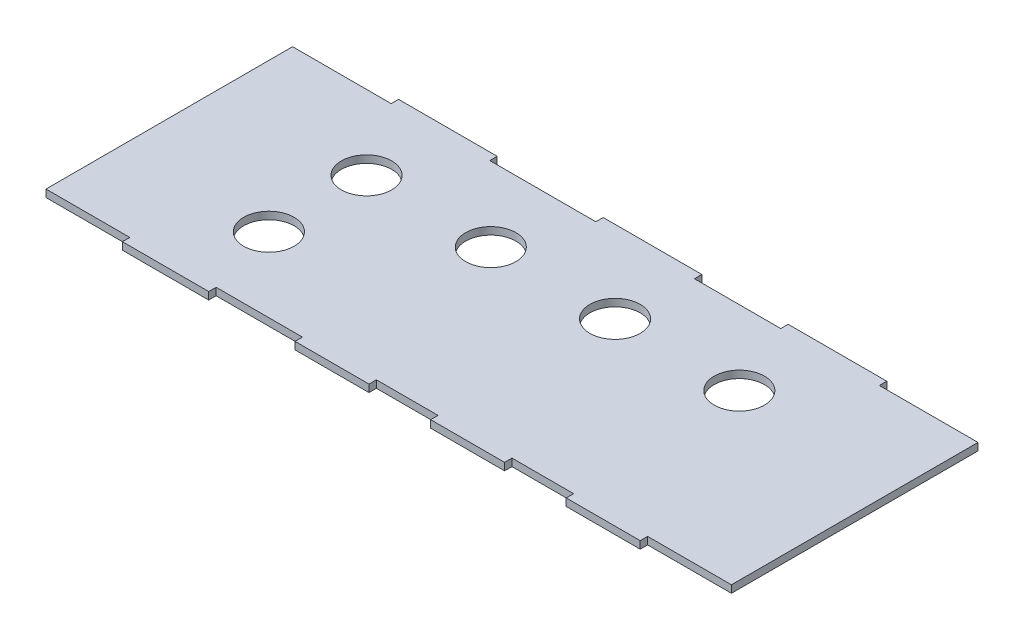
ISO-10303-21;
HEADER;
FILE_DESCRIPTION(('STEP AP214'),'2;1');
FILE_NAME('part.step','',(''),(''),'','','');
FILE_SCHEMA(('AUTOMOTIVE_DESIGN { 1 0 10303 214 1 1 1 1 }'));
ENDSEC;
DATA;
#1=APPLICATION_CONTEXT('core data for automotive mechanical design processes');
#2=APPLICATION_PROTOCOL_DEFINITION('international standard','automotive_design',2000,#1);
#3=PRODUCT_CONTEXT('',#1,'mechanical');
#4=PRODUCT('Part','Part','',(#3));
#5=PRODUCT_RELATED_PRODUCT_CATEGORY('part','',(#4));
#6=PRODUCT_DEFINITION_FORMATION('','',#4);
#7=PRODUCT_DEFINITION_CONTEXT('part definition',#1,'design');
#8=PRODUCT_DEFINITION('design','',#6,#7);
#9=PRODUCT_DEFINITION_SHAPE('','',#8);
#10=(LENGTH_UNIT() NAMED_UNIT(*) SI_UNIT(.MILLI.,.METRE.));
#11=(NAMED_UNIT(*) PLANE_ANGLE_UNIT() SI_UNIT($,.RADIAN.));
#12=(NAMED_UNIT(*) SI_UNIT($,.STERADIAN.) SOLID_ANGLE_UNIT());
#13=UNCERTAINTY_MEASURE_WITH_UNIT(LENGTH_MEASURE(1.E-05),#10,'distance_accuracy_value','');
#14=(GEOMETRIC_REPRESENTATION_CONTEXT(3) GLOBAL_UNCERTAINTY_ASSIGNED_CONTEXT((#13)) GLOBAL_UNIT_ASSIGNED_CONTEXT((#10,
#11,#12)) REPRESENTATION_CONTEXT('',''));
#15=CARTESIAN_POINT('',(0.,0.,0.));
#16=DIRECTION('',(0.,0.,1.));
#17=DIRECTION('',(1.,0.,0.));
#18=AXIS2_PLACEMENT_3D('',#15,#16,#17);
#19=CARTESIAN_POINT('',(-139.,3.,50.));
#20=DIRECTION('',(0.,0.,-1.));
#21=DIRECTION('',(-1.,0.,0.));
#22=AXIS2_PLACEMENT_3D('',#19,#20,#21);
#23=PLANE('',#22);
#24=DIRECTION('',(0.,-1.,0.));
#25=VECTOR('',#24,1.);
#26=CARTESIAN_POINT('',(75.0000000000471,3.,50.));
#27=LINE('',#26,#25);
#28=CARTESIAN_POINT('',(75.0000000000471,3.,50.));
#29=VERTEX_POINT('',#28);
#30=CARTESIAN_POINT('',(75.0000000000471,0.,50.));
#31=VERTEX_POINT('',#30);
#32=EDGE_CURVE('E55',#29,#31,#27,.T.);
#33=ORIENTED_EDGE('',*,*,#32,.F.);
#34=DIRECTION('',(1.,0.,0.));
#35=VECTOR('',#34,1.);
#36=CARTESIAN_POINT('',(-139.,3.,50.));
#37=LINE('',#36,#35);
#38=CARTESIAN_POINT('',(50.0000000000471,3.,50.));
#39=VERTEX_POINT('',#38);
#40=EDGE_CURVE('E615',#39,#29,#37,.T.);
#41=ORIENTED_EDGE('',*,*,#40,.F.);
#42=DIRECTION('',(0.,1.,0.));
#43=VECTOR('',#42,1.);
#44=CARTESIAN_POINT('',(50.0000000000471,3.,50.));
#45=LINE('',#44,#43);
#46=CARTESIAN_POINT('',(50.0000000000471,0.,50.));
#47=VERTEX_POINT('',#46);
#48=EDGE_CURVE('E268',#47,#39,#45,.T.);
#49=ORIENTED_EDGE('',*,*,#48,.F.);
#50=DIRECTION('',(1.,0.,0.));
#51=VECTOR('',#50,1.);
#52=CARTESIAN_POINT('',(-139.,0.,50.));
#53=LINE('',#52,#51);
#54=EDGE_CURVE('E626',#47,#31,#53,.T.);
#55=ORIENTED_EDGE('',*,*,#54,.T.);
#56=EDGE_LOOP('',(#33,#41,#49,#55));
#57=FACE_BOUND('',#56,.T.);
#58=ADVANCED_FACE('F32',(#57),#23,.F.);
#59=DIRECTION('',(0.,1.,0.));
#60=VECTOR('',#59,1.);
#61=CARTESIAN_POINT('',(105.000000000047,3.,50.));
#62=LINE('',#61,#60);
#63=CARTESIAN_POINT('',(105.000000000047,0.,50.));
#64=VERTEX_POINT('',#63);
#65=CARTESIAN_POINT('',(105.000000000047,3.,50.));
#66=VERTEX_POINT('',#65);
#67=EDGE_CURVE('E262',#64,#66,#62,.T.);
#68=ORIENTED_EDGE('',*,*,#67,.F.);
#69=CARTESIAN_POINT('',(139.,0.,50.));
#70=VERTEX_POINT('',#69);
#71=EDGE_CURVE('E481',#64,#70,#53,.T.);
#72=ORIENTED_EDGE('',*,*,#71,.T.);
#73=DIRECTION('',(0.,-1.,0.));
#74=VECTOR('',#73,1.);
#75=CARTESIAN_POINT('',(139.,3.,50.));
#76=LINE('',#75,#74);
#77=CARTESIAN_POINT('',(139.,3.,50.));
#78=VERTEX_POINT('',#77);
#79=EDGE_CURVE('E40',#78,#70,#76,.T.);
#80=ORIENTED_EDGE('',*,*,#79,.F.);
#81=EDGE_CURVE('E47',#66,#78,#37,.T.);
#82=ORIENTED_EDGE('',*,*,#81,.F.);
#83=EDGE_LOOP('',(#68,#72,#80,#82));
#84=FACE_BOUND('',#83,.T.);
#85=ADVANCED_FACE('F575',(#84),#23,.F.);
#86=DIRECTION('',(0.,-1.,0.));
#87=VECTOR('',#86,1.);
#88=CARTESIAN_POINT('',(20.0000000000471,3.,50.));
#89=LINE('',#88,#87);
#90=CARTESIAN_POINT('',(20.0000000000471,3.,50.));
#91=VERTEX_POINT('',#90);
#92=CARTESIAN_POINT('',(20.0000000000471,0.,50.));
#93=VERTEX_POINT('',#92);
#94=EDGE_CURVE('E265',#91,#93,#89,.T.);
#95=ORIENTED_EDGE('',*,*,#94,.F.);
#96=CARTESIAN_POINT('',(-4.99999999995288,3.,50.));
#97=VERTEX_POINT('',#96);
#98=EDGE_CURVE('E602',#97,#91,#37,.T.);
#99=ORIENTED_EDGE('',*,*,#98,.F.);
#100=DIRECTION('',(0.,1.,0.));
#101=VECTOR('',#100,1.);
#102=CARTESIAN_POINT('',(-4.99999999995288,3.,50.));
#103=LINE('',#102,#101);
#104=CARTESIAN_POINT('',(-4.9999999999529,0.,50.));
#105=VERTEX_POINT('',#104);
#106=EDGE_CURVE('E302',#105,#97,#103,.T.);
#107=ORIENTED_EDGE('',*,*,#106,.F.);
#108=EDGE_CURVE('E614',#105,#93,#53,.T.);
#109=ORIENTED_EDGE('',*,*,#108,.T.);
#110=EDGE_LOOP('',(#95,#99,#107,#109));
#111=FACE_BOUND('',#110,.T.);
#112=ADVANCED_FACE('F579',(#111),#23,.F.);
#113=DIRECTION('',(0.,-1.,0.));
#114=VECTOR('',#113,1.);
#115=CARTESIAN_POINT('',(-34.9999999999529,3.,50.));
#116=LINE('',#115,#114);
#117=CARTESIAN_POINT('',(-34.9999999999529,3.,50.));
#118=VERTEX_POINT('',#117);
#119=CARTESIAN_POINT('',(-34.9999999999529,0.,50.));
#120=VERTEX_POINT('',#119);
#121=EDGE_CURVE('E297',#118,#120,#116,.T.);
#122=ORIENTED_EDGE('',*,*,#121,.F.);
#123=CARTESIAN_POINT('',(-69.9999999999529,3.,50.));
#124=VERTEX_POINT('',#123);
#125=EDGE_CURVE('E471',#124,#118,#37,.T.);
#126=ORIENTED_EDGE('',*,*,#125,.F.);
#127=DIRECTION('',(0.,1.,0.));
#128=VECTOR('',#127,1.);
#129=CARTESIAN_POINT('',(-69.9999999999529,0.,50.));
#130=LINE('',#129,#128);
#131=CARTESIAN_POINT('',(-69.9999999999529,0.,50.));
#132=VERTEX_POINT('',#131);
#133=EDGE_CURVE('E329',#132,#124,#130,.T.);
#134=ORIENTED_EDGE('',*,*,#133,.F.);
#135=EDGE_CURVE('E485',#132,#120,#53,.T.);
#136=ORIENTED_EDGE('',*,*,#135,.T.);
#137=EDGE_LOOP('',(#122,#126,#134,#136));
#138=FACE_BOUND('',#137,.T.);
#139=ADVANCED_FACE('F582',(#138),#23,.F.);
#140=DIRECTION('',(0.,-1.,0.));
#141=VECTOR('',#140,1.);
#142=CARTESIAN_POINT('',(-104.999999999953,0.,50.));
#143=LINE('',#142,#141);
#144=CARTESIAN_POINT('',(-104.999999999953,3.,50.));
#145=VERTEX_POINT('',#144);
#146=CARTESIAN_POINT('',(-104.999999999953,0.,50.));
#147=VERTEX_POINT('',#146);
#148=EDGE_CURVE('E324',#145,#147,#143,.T.);
#149=ORIENTED_EDGE('',*,*,#148,.F.);
#150=CARTESIAN_POINT('',(-139.,3.,50.));
#151=VERTEX_POINT('',#150);
#152=EDGE_CURVE('E467',#151,#145,#37,.T.);
#153=ORIENTED_EDGE('',*,*,#152,.F.);
#154=DIRECTION('',(0.,-1.,0.));
#155=VECTOR('',#154,1.);
#156=CARTESIAN_POINT('',(-139.,3.,50.));
#157=LINE('',#156,#155);
#158=CARTESIAN_POINT('',(-139.,0.,50.));
#159=VERTEX_POINT('',#158);
#160=EDGE_CURVE('E11',#151,#159,#157,.T.);
#161=ORIENTED_EDGE('',*,*,#160,.T.);
#162=EDGE_CURVE('E482',#159,#147,#53,.T.);
#163=ORIENTED_EDGE('',*,*,#162,.T.);
#164=EDGE_LOOP('',(#149,#153,#161,#163));
#165=FACE_BOUND('',#164,.T.);
#166=ADVANCED_FACE('F538',(#165),#23,.F.);
#167=CARTESIAN_POINT('',(-139.,3.,-50.));
#168=DIRECTION('',(0.,0.,1.));
#169=DIRECTION('',(1.,0.,0.));
#170=AXIS2_PLACEMENT_3D('',#167,#168,#169);
#171=PLANE('',#170);
#172=DIRECTION('',(0.,-1.,0.));
#173=VECTOR('',#172,1.);
#174=CARTESIAN_POINT('',(-58.9999999999999,0.,-50.));
#175=LINE('',#174,#173);
#176=CARTESIAN_POINT('',(-58.9999999999999,3.,-50.));
#177=VERTEX_POINT('',#176);
#178=CARTESIAN_POINT('',(-58.9999999999999,0.,-50.));
#179=VERTEX_POINT('',#178);
#180=EDGE_CURVE('E355',#177,#179,#175,.T.);
#181=ORIENTED_EDGE('',*,*,#180,.F.);
#182=DIRECTION('',(-1.,0.,0.));
#183=VECTOR('',#182,1.);
#184=CARTESIAN_POINT('',(-139.,3.,-50.));
#185=LINE('',#184,#183);
#186=CARTESIAN_POINT('',(-16.,3.,-50.));
#187=VERTEX_POINT('',#186);
#188=EDGE_CURVE('E542',#187,#177,#185,.T.);
#189=ORIENTED_EDGE('',*,*,#188,.F.);
#190=DIRECTION('',(0.,1.,0.));
#191=VECTOR('',#190,1.);
#192=CARTESIAN_POINT('',(-16.,0.,-50.));
#193=LINE('',#192,#191);
#194=CARTESIAN_POINT('',(-16.,0.,-50.));
#195=VERTEX_POINT('',#194);
#196=EDGE_CURVE('E413',#195,#187,#193,.T.);
#197=ORIENTED_EDGE('',*,*,#196,.F.);
#198=DIRECTION('',(-1.,0.,0.));
#199=VECTOR('',#198,1.);
#200=CARTESIAN_POINT('',(-139.,0.,-50.));
#201=LINE('',#200,#199);
#202=EDGE_CURVE('E525',#195,#179,#201,.T.);
#203=ORIENTED_EDGE('',*,*,#202,.T.);
#204=EDGE_LOOP('',(#181,#189,#197,#203));
#205=FACE_BOUND('',#204,.T.);
#206=ADVANCED_FACE('F558',(#205),#171,.F.);
#207=DIRECTION('',(0.,1.,0.));
#208=VECTOR('',#207,1.);
#209=CARTESIAN_POINT('',(-99.,0.,-50.));
#210=LINE('',#209,#208);
#211=CARTESIAN_POINT('',(-99.,0.,-50.));
#212=VERTEX_POINT('',#211);
#213=CARTESIAN_POINT('',(-99.,3.,-50.));
#214=VERTEX_POINT('',#213);
#215=EDGE_CURVE('E386',#212,#214,#210,.T.);
#216=ORIENTED_EDGE('',*,*,#215,.F.);
#217=CARTESIAN_POINT('',(-139.,0.,-50.));
#218=VERTEX_POINT('',#217);
#219=EDGE_CURVE('E487',#212,#218,#201,.T.);
#220=ORIENTED_EDGE('',*,*,#219,.T.);
#221=DIRECTION('',(0.,-1.,0.));
#222=VECTOR('',#221,1.);
#223=CARTESIAN_POINT('',(-139.,3.,-50.));
#224=LINE('',#223,#222);
#225=CARTESIAN_POINT('',(-139.,3.,-50.));
#226=VERTEX_POINT('',#225);
#227=EDGE_CURVE('E477',#226,#218,#224,.T.);
#228=ORIENTED_EDGE('',*,*,#227,.F.);
#229=EDGE_CURVE('E473',#214,#226,#185,.T.);
#230=ORIENTED_EDGE('',*,*,#229,.F.);
#231=EDGE_LOOP('',(#216,#220,#228,#230));
#232=FACE_BOUND('',#231,.T.);
#233=ADVANCED_FACE('F531',(#232),#171,.F.);
#234=DIRECTION('',(0.,-1.,0.));
#235=VECTOR('',#234,1.);
#236=CARTESIAN_POINT('',(24.,0.,-50.));
#237=LINE('',#236,#235);
#238=CARTESIAN_POINT('',(24.,3.,-50.));
#239=VERTEX_POINT('',#238);
#240=CARTESIAN_POINT('',(24.,0.,-50.));
#241=VERTEX_POINT('',#240);
#242=EDGE_CURVE('E408',#239,#241,#237,.T.);
#243=ORIENTED_EDGE('',*,*,#242,.F.);
#244=CARTESIAN_POINT('',(59.,3.,-50.));
#245=VERTEX_POINT('',#244);
#246=EDGE_CURVE('E478',#245,#239,#185,.T.);
#247=ORIENTED_EDGE('',*,*,#246,.F.);
#248=DIRECTION('',(0.,1.,0.));
#249=VECTOR('',#248,1.);
#250=CARTESIAN_POINT('',(59.,0.,-50.));
#251=LINE('',#250,#249);
#252=CARTESIAN_POINT('',(59.,0.,-50.));
#253=VERTEX_POINT('',#252);
#254=EDGE_CURVE('E440',#253,#245,#251,.T.);
#255=ORIENTED_EDGE('',*,*,#254,.F.);
#256=EDGE_CURVE('E489',#253,#241,#201,.T.);
#257=ORIENTED_EDGE('',*,*,#256,.T.);
#258=EDGE_LOOP('',(#243,#247,#255,#257));
#259=FACE_BOUND('',#258,.T.);
#260=ADVANCED_FACE('F523',(#259),#171,.F.);
#261=DIRECTION('',(0.,-1.,0.));
#262=VECTOR('',#261,1.);
#263=CARTESIAN_POINT('',(99.,0.,-50.));
#264=LINE('',#263,#262);
#265=CARTESIAN_POINT('',(99.,3.,-50.));
#266=VERTEX_POINT('',#265);
#267=CARTESIAN_POINT('',(99.,0.,-50.));
#268=VERTEX_POINT('',#267);
#269=EDGE_CURVE('E435',#266,#268,#264,.T.);
#270=ORIENTED_EDGE('',*,*,#269,.F.);
#271=CARTESIAN_POINT('',(139.,3.,-50.));
#272=VERTEX_POINT('',#271);
#273=EDGE_CURVE('E474',#272,#266,#185,.T.);
#274=ORIENTED_EDGE('',*,*,#273,.F.);
#275=DIRECTION('',(0.,-1.,0.));
#276=VECTOR('',#275,1.);
#277=CARTESIAN_POINT('',(139.,3.,-50.));
#278=LINE('',#277,#276);
#279=CARTESIAN_POINT('',(139.,0.,-50.));
#280=VERTEX_POINT('',#279);
#281=EDGE_CURVE('E492',#272,#280,#278,.T.);
#282=ORIENTED_EDGE('',*,*,#281,.T.);
#283=EDGE_CURVE('E466',#280,#268,#201,.T.);
#284=ORIENTED_EDGE('',*,*,#283,.T.);
#285=EDGE_LOOP('',(#270,#274,#282,#284));
#286=FACE_BOUND('',#285,.T.);
#287=ADVANCED_FACE('F503',(#286),#171,.F.);
#288=CARTESIAN_POINT('',(-139.,3.,-50.));
#289=DIRECTION('',(1.,0.,0.));
#290=DIRECTION('',(0.,0.,-1.));
#291=AXIS2_PLACEMENT_3D('',#288,#289,#290);
#292=PLANE('',#291);
#293=DIRECTION('',(0.,0.,1.));
#294=VECTOR('',#293,1.);
#295=CARTESIAN_POINT('',(-139.,0.,-50.));
#296=LINE('',#295,#294);
#297=EDGE_CURVE('E462',#218,#159,#296,.T.);
#298=ORIENTED_EDGE('',*,*,#297,.T.);
#299=ORIENTED_EDGE('',*,*,#160,.F.);
#300=DIRECTION('',(0.,0.,1.));
#301=VECTOR('',#300,1.);
#302=CARTESIAN_POINT('',(-139.,3.,-50.));
#303=LINE('',#302,#301);
#304=EDGE_CURVE('E463',#226,#151,#303,.T.);
#305=ORIENTED_EDGE('',*,*,#304,.F.);
#306=ORIENTED_EDGE('',*,*,#227,.T.);
#307=EDGE_LOOP('',(#298,#299,#305,#306));
#308=FACE_BOUND('',#307,.T.);
#309=ADVANCED_FACE('F34',(#308),#292,.F.);
#310=CARTESIAN_POINT('',(139.,3.,-50.));
#311=DIRECTION('',(-1.,0.,0.));
#312=DIRECTION('',(0.,0.,1.));
#313=AXIS2_PLACEMENT_3D('',#310,#311,#312);
#314=PLANE('',#313);
#315=DIRECTION('',(0.,0.,-1.));
#316=VECTOR('',#315,1.);
#317=CARTESIAN_POINT('',(139.,0.,-50.));
#318=LINE('',#317,#316);
#319=EDGE_CURVE('E484',#70,#280,#318,.T.);
#320=ORIENTED_EDGE('',*,*,#319,.T.);
#321=ORIENTED_EDGE('',*,*,#281,.F.);
#322=DIRECTION('',(0.,0.,-1.));
#323=VECTOR('',#322,1.);
#324=CARTESIAN_POINT('',(139.,3.,-50.));
#325=LINE('',#324,#323);
#326=EDGE_CURVE('E470',#78,#272,#325,.T.);
#327=ORIENTED_EDGE('',*,*,#326,.F.);
#328=ORIENTED_EDGE('',*,*,#79,.T.);
#329=EDGE_LOOP('',(#320,#321,#327,#328));
#330=FACE_BOUND('',#329,.T.);
#331=ADVANCED_FACE('F498',(#330),#314,.F.);
#332=CARTESIAN_POINT('',(0.,3.,0.));
#333=DIRECTION('',(0.,1.,0.));
#334=DIRECTION('',(0.,0.,1.));
#335=AXIS2_PLACEMENT_3D('',#332,#333,#334);
#336=PLANE('',#335);
#337=CARTESIAN_POINT('',(72.4,3.,-19.7999999999985));
#338=DIRECTION('',(0.,1.,0.));
#339=DIRECTION('',(0.,0.,1.));
#340=AXIS2_PLACEMENT_3D('',#337,#338,#339);
#341=CIRCLE('',#340,10.2);
#342=CARTESIAN_POINT('',(72.4,3.,-9.59999999999846));
#343=VERTEX_POINT('',#342);
#344=EDGE_CURVE('E356',#343,#343,#341,.T.);
#345=ORIENTED_EDGE('',*,*,#344,.F.);
#346=EDGE_LOOP('',(#345));
#347=FACE_BOUND('',#346,.T.);
#348=CARTESIAN_POINT('',(-78.8,3.,-19.7999999999985));
#349=DIRECTION('',(0.,1.,0.));
#350=DIRECTION('',(0.,0.,1.));
#351=AXIS2_PLACEMENT_3D('',#348,#349,#350);
#352=CIRCLE('',#351,10.2);
#353=CARTESIAN_POINT('',(-78.8,3.,-9.59999999999846));
#354=VERTEX_POINT('',#353);
#355=EDGE_CURVE('E351',#354,#354,#352,.T.);
#356=ORIENTED_EDGE('',*,*,#355,.F.);
#357=EDGE_LOOP('',(#356));
#358=FACE_BOUND('',#357,.T.);
#359=CARTESIAN_POINT('',(-28.4,3.,-19.7999999999985));
#360=DIRECTION('',(0.,1.,0.));
#361=DIRECTION('',(0.,0.,1.));
#362=AXIS2_PLACEMENT_3D('',#359,#360,#361);
#363=CIRCLE('',#362,10.2);
#364=CARTESIAN_POINT('',(-28.4,3.,-9.59999999999846));
#365=VERTEX_POINT('',#364);
#366=EDGE_CURVE('E364',#365,#365,#363,.T.);
#367=ORIENTED_EDGE('',*,*,#366,.F.);
#368=EDGE_LOOP('',(#367));
#369=FACE_BOUND('',#368,.T.);
#370=CARTESIAN_POINT('',(22.,3.,-19.7999999999985));
#371=DIRECTION('',(0.,1.,0.));
#372=DIRECTION('',(0.,0.,1.));
#373=AXIS2_PLACEMENT_3D('',#370,#371,#372);
#374=CIRCLE('',#373,10.2);
#375=CARTESIAN_POINT('',(22.,3.,-9.59999999999846));
#376=VERTEX_POINT('',#375);
#377=EDGE_CURVE('E363',#376,#376,#374,.T.);
#378=ORIENTED_EDGE('',*,*,#377,.F.);
#379=EDGE_LOOP('',(#378));
#380=FACE_BOUND('',#379,.T.);
#381=CARTESIAN_POINT('',(-78.8,3.,19.8));
#382=DIRECTION('',(0.,1.,0.));
#383=DIRECTION('',(0.,0.,1.));
#384=AXIS2_PLACEMENT_3D('',#381,#382,#383);
#385=CIRCLE('',#384,10.2);
#386=CARTESIAN_POINT('',(-78.8,3.,30.));
#387=VERTEX_POINT('',#386);
#388=EDGE_CURVE('E374',#387,#387,#385,.T.);
#389=ORIENTED_EDGE('',*,*,#388,.F.);
#390=EDGE_LOOP('',(#389));
#391=FACE_BOUND('',#390,.T.);
#392=ORIENTED_EDGE('',*,*,#304,.T.);
#393=ORIENTED_EDGE('',*,*,#152,.T.);
#394=DIRECTION('',(0.,0.,-1.));
#395=VECTOR('',#394,1.);
#396=CARTESIAN_POINT('',(-104.999999999953,3.,53.));
#397=LINE('',#396,#395);
#398=CARTESIAN_POINT('',(-104.999999999953,3.,53.));
#399=VERTEX_POINT('',#398);
#400=EDGE_CURVE('E335',#399,#145,#397,.T.);
#401=ORIENTED_EDGE('',*,*,#400,.F.);
#402=DIRECTION('',(-1.,0.,0.));
#403=VECTOR('',#402,1.);
#404=CARTESIAN_POINT('',(-104.999999999953,3.,53.));
#405=LINE('',#404,#403);
#406=CARTESIAN_POINT('',(-69.9999999999529,3.,53.));
#407=VERTEX_POINT('',#406);
#408=EDGE_CURVE('E333',#407,#399,#405,.T.);
#409=ORIENTED_EDGE('',*,*,#408,.F.);
#410=DIRECTION('',(0.,0.,-1.));
#411=VECTOR('',#410,1.);
#412=CARTESIAN_POINT('',(-69.9999999999529,3.,53.));
#413=LINE('',#412,#411);
#414=EDGE_CURVE('E342',#407,#124,#413,.T.);
#415=ORIENTED_EDGE('',*,*,#414,.T.);
#416=ORIENTED_EDGE('',*,*,#125,.T.);
#417=DIRECTION('',(0.,0.,-1.));
#418=VECTOR('',#417,1.);
#419=CARTESIAN_POINT('',(-34.9999999999529,3.,53.));
#420=LINE('',#419,#418);
#421=CARTESIAN_POINT('',(-34.9999999999529,3.,53.));
#422=VERTEX_POINT('',#421);
#423=EDGE_CURVE('E308',#422,#118,#420,.T.);
#424=ORIENTED_EDGE('',*,*,#423,.F.);
#425=DIRECTION('',(-1.,0.,0.));
#426=VECTOR('',#425,1.);
#427=CARTESIAN_POINT('',(-34.9999999999529,3.,53.));
#428=LINE('',#427,#426);
#429=CARTESIAN_POINT('',(-4.99999999995288,3.,53.));
#430=VERTEX_POINT('',#429);
#431=EDGE_CURVE('E306',#430,#422,#428,.T.);
#432=ORIENTED_EDGE('',*,*,#431,.F.);
#433=DIRECTION('',(0.,0.,-1.));
#434=VECTOR('',#433,1.);
#435=CARTESIAN_POINT('',(-4.99999999995288,3.,53.));
#436=LINE('',#435,#434);
#437=EDGE_CURVE('E315',#430,#97,#436,.T.);
#438=ORIENTED_EDGE('',*,*,#437,.T.);
#439=ORIENTED_EDGE('',*,*,#98,.T.);
#440=DIRECTION('',(0.,0.,-1.));
#441=VECTOR('',#440,1.);
#442=CARTESIAN_POINT('',(20.0000000000471,3.,53.));
#443=LINE('',#442,#441);
#444=CARTESIAN_POINT('',(20.0000000000471,3.,53.));
#445=VERTEX_POINT('',#444);
#446=EDGE_CURVE('E282',#445,#91,#443,.T.);
#447=ORIENTED_EDGE('',*,*,#446,.F.);
#448=DIRECTION('',(-1.,0.,0.));
#449=VECTOR('',#448,1.);
#450=CARTESIAN_POINT('',(20.0000000000471,3.,53.));
#451=LINE('',#450,#449);
#452=CARTESIAN_POINT('',(50.0000000000471,3.,53.));
#453=VERTEX_POINT('',#452);
#454=EDGE_CURVE('E281',#453,#445,#451,.T.);
#455=ORIENTED_EDGE('',*,*,#454,.F.);
#456=DIRECTION('',(0.,0.,-1.));
#457=VECTOR('',#456,1.);
#458=CARTESIAN_POINT('',(50.0000000000471,3.,53.));
#459=LINE('',#458,#457);
#460=EDGE_CURVE('E288',#453,#39,#459,.T.);
#461=ORIENTED_EDGE('',*,*,#460,.T.);
#462=ORIENTED_EDGE('',*,*,#40,.T.);
#463=DIRECTION('',(0.,0.,-1.));
#464=VECTOR('',#463,1.);
#465=CARTESIAN_POINT('',(75.0000000000471,3.,53.));
#466=LINE('',#465,#464);
#467=CARTESIAN_POINT('',(75.0000000000471,3.,53.));
#468=VERTEX_POINT('',#467);
#469=EDGE_CURVE('E619',#468,#29,#466,.T.);
#470=ORIENTED_EDGE('',*,*,#469,.F.);
#471=DIRECTION('',(-1.,0.,0.));
#472=VECTOR('',#471,1.);
#473=CARTESIAN_POINT('',(75.0000000000471,3.,53.));
#474=LINE('',#473,#472);
#475=CARTESIAN_POINT('',(105.000000000047,3.,53.));
#476=VERTEX_POINT('',#475);
#477=EDGE_CURVE('E258',#476,#468,#474,.T.);
#478=ORIENTED_EDGE('',*,*,#477,.F.);
#479=DIRECTION('',(0.,0.,-1.));
#480=VECTOR('',#479,1.);
#481=CARTESIAN_POINT('',(105.000000000047,3.,53.));
#482=LINE('',#481,#480);
#483=EDGE_CURVE('E270',#476,#66,#482,.T.);
#484=ORIENTED_EDGE('',*,*,#483,.T.);
#485=ORIENTED_EDGE('',*,*,#81,.T.);
#486=ORIENTED_EDGE('',*,*,#326,.T.);
#487=ORIENTED_EDGE('',*,*,#273,.T.);
#488=DIRECTION('',(0.,0.,1.));
#489=VECTOR('',#488,1.);
#490=CARTESIAN_POINT('',(99.,3.,-53.));
#491=LINE('',#490,#489);
#492=CARTESIAN_POINT('',(99.,3.,-53.));
#493=VERTEX_POINT('',#492);
#494=EDGE_CURVE('E446',#493,#266,#491,.T.);
#495=ORIENTED_EDGE('',*,*,#494,.F.);
#496=DIRECTION('',(1.,0.,0.));
#497=VECTOR('',#496,1.);
#498=CARTESIAN_POINT('',(99.,3.,-53.));
#499=LINE('',#498,#497);
#500=CARTESIAN_POINT('',(59.,3.,-53.));
#501=VERTEX_POINT('',#500);
#502=EDGE_CURVE('E444',#501,#493,#499,.T.);
#503=ORIENTED_EDGE('',*,*,#502,.F.);
#504=DIRECTION('',(0.,0.,1.));
#505=VECTOR('',#504,1.);
#506=CARTESIAN_POINT('',(59.,3.,-53.));
#507=LINE('',#506,#505);
#508=EDGE_CURVE('E453',#501,#245,#507,.T.);
#509=ORIENTED_EDGE('',*,*,#508,.T.);
#510=ORIENTED_EDGE('',*,*,#246,.T.);
#511=DIRECTION('',(0.,0.,1.));
#512=VECTOR('',#511,1.);
#513=CARTESIAN_POINT('',(24.,3.,-53.));
#514=LINE('',#513,#512);
#515=CARTESIAN_POINT('',(24.,3.,-53.));
#516=VERTEX_POINT('',#515);
#517=EDGE_CURVE('E419',#516,#239,#514,.T.);
#518=ORIENTED_EDGE('',*,*,#517,.F.);
#519=DIRECTION('',(1.,0.,0.));
#520=VECTOR('',#519,1.);
#521=CARTESIAN_POINT('',(24.,3.,-53.));
#522=LINE('',#521,#520);
#523=CARTESIAN_POINT('',(-16.,3.,-53.));
#524=VERTEX_POINT('',#523);
#525=EDGE_CURVE('E417',#524,#516,#522,.T.);
#526=ORIENTED_EDGE('',*,*,#525,.F.);
#527=DIRECTION('',(0.,0.,1.));
#528=VECTOR('',#527,1.);
#529=CARTESIAN_POINT('',(-16.,3.,-53.));
#530=LINE('',#529,#528);
#531=EDGE_CURVE('E426',#524,#187,#530,.T.);
#532=ORIENTED_EDGE('',*,*,#531,.T.);
#533=ORIENTED_EDGE('',*,*,#188,.T.);
#534=DIRECTION('',(0.,0.,1.));
#535=VECTOR('',#534,1.);
#536=CARTESIAN_POINT('',(-59.,3.,-53.));
#537=LINE('',#536,#535);
#538=CARTESIAN_POINT('',(-59.,3.,-53.));
#539=VERTEX_POINT('',#538);
#540=EDGE_CURVE('E392',#539,#177,#537,.T.);
#541=ORIENTED_EDGE('',*,*,#540,.F.);
#542=DIRECTION('',(1.,0.,0.));
#543=VECTOR('',#542,1.);
#544=CARTESIAN_POINT('',(-59.,3.,-53.));
#545=LINE('',#544,#543);
#546=CARTESIAN_POINT('',(-99.,3.,-53.));
#547=VERTEX_POINT('',#546);
#548=EDGE_CURVE('E390',#547,#539,#545,.T.);
#549=ORIENTED_EDGE('',*,*,#548,.F.);
#550=DIRECTION('',(0.,0.,1.));
#551=VECTOR('',#550,1.);
#552=CARTESIAN_POINT('',(-99.,3.,-53.));
#553=LINE('',#552,#551);
#554=EDGE_CURVE('E399',#547,#214,#553,.T.);
#555=ORIENTED_EDGE('',*,*,#554,.T.);
#556=ORIENTED_EDGE('',*,*,#229,.T.);
#557=EDGE_LOOP('',(#392,#393,#401,#409,#415,#416,#424,#432,#438,#439,#447,#455,#461,#462,#470,
#478,#484,#485,#486,#487,#495,#503,#509,#510,#518,#526,#532,#533,#541,#549,#555,#556));
#558=FACE_BOUND('',#557,.T.);
#559=ADVANCED_FACE('F507',(#347,#358,#369,#380,#391,#558),#336,.T.);
#560=CARTESIAN_POINT('',(0.,0.,0.));
#561=DIRECTION('',(0.,1.,0.));
#562=DIRECTION('',(0.,0.,1.));
#563=AXIS2_PLACEMENT_3D('',#560,#561,#562);
#564=PLANE('',#563);
#565=CARTESIAN_POINT('',(72.4,0.,-19.7999999999985));
#566=DIRECTION('',(0.,1.,0.));
#567=DIRECTION('',(0.,0.,1.));
#568=AXIS2_PLACEMENT_3D('',#565,#566,#567);
#569=CIRCLE('',#568,10.2);
#570=CARTESIAN_POINT('',(72.4,0.,-9.59999999999846));
#571=VERTEX_POINT('',#570);
#572=EDGE_CURVE('E352',#571,#571,#569,.T.);
#573=ORIENTED_EDGE('',*,*,#572,.T.);
#574=EDGE_LOOP('',(#573));
#575=FACE_BOUND('',#574,.T.);
#576=CARTESIAN_POINT('',(-78.8,0.,-19.7999999999985));
#577=DIRECTION('',(0.,1.,0.));
#578=DIRECTION('',(0.,0.,1.));
#579=AXIS2_PLACEMENT_3D('',#576,#577,#578);
#580=CIRCLE('',#579,10.2);
#581=CARTESIAN_POINT('',(-78.8,0.,-9.59999999999846));
#582=VERTEX_POINT('',#581);
#583=EDGE_CURVE('E367',#582,#582,#580,.T.);
#584=ORIENTED_EDGE('',*,*,#583,.T.);
#585=EDGE_LOOP('',(#584));
#586=FACE_BOUND('',#585,.T.);
#587=CARTESIAN_POINT('',(-28.4,0.,-19.7999999999985));
#588=DIRECTION('',(0.,1.,0.));
#589=DIRECTION('',(0.,0.,1.));
#590=AXIS2_PLACEMENT_3D('',#587,#588,#589);
#591=CIRCLE('',#590,10.2);
#592=CARTESIAN_POINT('',(-28.4,0.,-9.59999999999846));
#593=VERTEX_POINT('',#592);
#594=EDGE_CURVE('E360',#593,#593,#591,.T.);
#595=ORIENTED_EDGE('',*,*,#594,.T.);
#596=EDGE_LOOP('',(#595));
#597=FACE_BOUND('',#596,.T.);
#598=CARTESIAN_POINT('',(22.,0.,-19.7999999999985));
#599=DIRECTION('',(0.,1.,0.));
#600=DIRECTION('',(0.,0.,1.));
#601=AXIS2_PLACEMENT_3D('',#598,#599,#600);
#602=CIRCLE('',#601,10.2);
#603=CARTESIAN_POINT('',(22.,0.,-9.59999999999846));
#604=VERTEX_POINT('',#603);
#605=EDGE_CURVE('E377',#604,#604,#602,.T.);
#606=ORIENTED_EDGE('',*,*,#605,.T.);
#607=EDGE_LOOP('',(#606));
#608=FACE_BOUND('',#607,.T.);
#609=CARTESIAN_POINT('',(-78.8,0.,19.8));
#610=DIRECTION('',(0.,1.,0.));
#611=DIRECTION('',(0.,0.,1.));
#612=AXIS2_PLACEMENT_3D('',#609,#610,#611);
#613=CIRCLE('',#612,10.2);
#614=CARTESIAN_POINT('',(-78.8,0.,30.));
#615=VERTEX_POINT('',#614);
#616=EDGE_CURVE('E359',#615,#615,#613,.T.);
#617=ORIENTED_EDGE('',*,*,#616,.T.);
#618=EDGE_LOOP('',(#617));
#619=FACE_BOUND('',#618,.T.);
#620=ORIENTED_EDGE('',*,*,#297,.F.);
#621=ORIENTED_EDGE('',*,*,#219,.F.);
#622=DIRECTION('',(0.,0.,1.));
#623=VECTOR('',#622,1.);
#624=CARTESIAN_POINT('',(-99.,0.,-53.));
#625=LINE('',#624,#623);
#626=CARTESIAN_POINT('',(-99.,0.,-53.));
#627=VERTEX_POINT('',#626);
#628=EDGE_CURVE('E402',#627,#212,#625,.T.);
#629=ORIENTED_EDGE('',*,*,#628,.F.);
#630=DIRECTION('',(-1.,0.,0.));
#631=VECTOR('',#630,1.);
#632=CARTESIAN_POINT('',(-58.9999999999999,0.,-53.));
#633=LINE('',#632,#631);
#634=CARTESIAN_POINT('',(-58.9999999999999,0.,-53.));
#635=VERTEX_POINT('',#634);
#636=EDGE_CURVE('E385',#635,#627,#633,.T.);
#637=ORIENTED_EDGE('',*,*,#636,.F.);
#638=DIRECTION('',(0.,0.,1.));
#639=VECTOR('',#638,1.);
#640=CARTESIAN_POINT('',(-58.9999999999999,0.,-53.));
#641=LINE('',#640,#639);
#642=EDGE_CURVE('E405',#635,#179,#641,.T.);
#643=ORIENTED_EDGE('',*,*,#642,.T.);
#644=ORIENTED_EDGE('',*,*,#202,.F.);
#645=DIRECTION('',(0.,0.,1.));
#646=VECTOR('',#645,1.);
#647=CARTESIAN_POINT('',(-16.,0.,-53.));
#648=LINE('',#647,#646);
#649=CARTESIAN_POINT('',(-16.,0.,-53.));
#650=VERTEX_POINT('',#649);
#651=EDGE_CURVE('E429',#650,#195,#648,.T.);
#652=ORIENTED_EDGE('',*,*,#651,.F.);
#653=DIRECTION('',(-1.,0.,0.));
#654=VECTOR('',#653,1.);
#655=CARTESIAN_POINT('',(24.,0.,-53.));
#656=LINE('',#655,#654);
#657=CARTESIAN_POINT('',(24.,0.,-53.));
#658=VERTEX_POINT('',#657);
#659=EDGE_CURVE('E412',#658,#650,#656,.T.);
#660=ORIENTED_EDGE('',*,*,#659,.F.);
#661=DIRECTION('',(0.,0.,1.));
#662=VECTOR('',#661,1.);
#663=CARTESIAN_POINT('',(24.,0.,-53.));
#664=LINE('',#663,#662);
#665=EDGE_CURVE('E432',#658,#241,#664,.T.);
#666=ORIENTED_EDGE('',*,*,#665,.T.);
#667=ORIENTED_EDGE('',*,*,#256,.F.);
#668=DIRECTION('',(0.,0.,1.));
#669=VECTOR('',#668,1.);
#670=CARTESIAN_POINT('',(59.,0.,-53.));
#671=LINE('',#670,#669);
#672=CARTESIAN_POINT('',(59.,0.,-53.));
#673=VERTEX_POINT('',#672);
#674=EDGE_CURVE('E456',#673,#253,#671,.T.);
#675=ORIENTED_EDGE('',*,*,#674,.F.);
#676=DIRECTION('',(-1.,0.,0.));
#677=VECTOR('',#676,1.);
#678=CARTESIAN_POINT('',(99.,0.,-53.));
#679=LINE('',#678,#677);
#680=CARTESIAN_POINT('',(99.,0.,-53.));
#681=VERTEX_POINT('',#680);
#682=EDGE_CURVE('E439',#681,#673,#679,.T.);
#683=ORIENTED_EDGE('',*,*,#682,.F.);
#684=DIRECTION('',(0.,0.,1.));
#685=VECTOR('',#684,1.);
#686=CARTESIAN_POINT('',(99.,0.,-53.));
#687=LINE('',#686,#685);
#688=EDGE_CURVE('E459',#681,#268,#687,.T.);
#689=ORIENTED_EDGE('',*,*,#688,.T.);
#690=ORIENTED_EDGE('',*,*,#283,.F.);
#691=ORIENTED_EDGE('',*,*,#319,.F.);
#692=ORIENTED_EDGE('',*,*,#71,.F.);
#693=DIRECTION('',(0.,0.,-1.));
#694=VECTOR('',#693,1.);
#695=CARTESIAN_POINT('',(105.000000000047,0.,53.));
#696=LINE('',#695,#694);
#697=CARTESIAN_POINT('',(105.000000000047,0.,53.));
#698=VERTEX_POINT('',#697);
#699=EDGE_CURVE('E249',#698,#64,#696,.T.);
#700=ORIENTED_EDGE('',*,*,#699,.F.);
#701=DIRECTION('',(1.,0.,0.));
#702=VECTOR('',#701,1.);
#703=CARTESIAN_POINT('',(75.0000000000471,0.,53.));
#704=LINE('',#703,#702);
#705=CARTESIAN_POINT('',(75.0000000000471,0.,53.));
#706=VERTEX_POINT('',#705);
#707=EDGE_CURVE('E242',#706,#698,#704,.T.);
#708=ORIENTED_EDGE('',*,*,#707,.F.);
#709=DIRECTION('',(0.,0.,-1.));
#710=VECTOR('',#709,1.);
#711=CARTESIAN_POINT('',(75.0000000000471,0.,53.));
#712=LINE('',#711,#710);
#713=EDGE_CURVE('E247',#706,#31,#712,.T.);
#714=ORIENTED_EDGE('',*,*,#713,.T.);
#715=ORIENTED_EDGE('',*,*,#54,.F.);
#716=DIRECTION('',(0.,0.,-1.));
#717=VECTOR('',#716,1.);
#718=CARTESIAN_POINT('',(50.0000000000471,0.,53.));
#719=LINE('',#718,#717);
#720=CARTESIAN_POINT('',(50.0000000000471,0.,53.));
#721=VERTEX_POINT('',#720);
#722=EDGE_CURVE('E291',#721,#47,#719,.T.);
#723=ORIENTED_EDGE('',*,*,#722,.F.);
#724=DIRECTION('',(1.,0.,0.));
#725=VECTOR('',#724,1.);
#726=CARTESIAN_POINT('',(20.0000000000471,0.,53.));
#727=LINE('',#726,#725);
#728=CARTESIAN_POINT('',(20.0000000000471,0.,53.));
#729=VERTEX_POINT('',#728);
#730=EDGE_CURVE('E277',#729,#721,#727,.T.);
#731=ORIENTED_EDGE('',*,*,#730,.F.);
#732=DIRECTION('',(0.,0.,-1.));
#733=VECTOR('',#732,1.);
#734=CARTESIAN_POINT('',(20.0000000000471,0.,53.));
#735=LINE('',#734,#733);
#736=EDGE_CURVE('E294',#729,#93,#735,.T.);
#737=ORIENTED_EDGE('',*,*,#736,.T.);
#738=ORIENTED_EDGE('',*,*,#108,.F.);
#739=DIRECTION('',(0.,0.,-1.));
#740=VECTOR('',#739,1.);
#741=CARTESIAN_POINT('',(-4.9999999999529,0.,53.));
#742=LINE('',#741,#740);
#743=CARTESIAN_POINT('',(-4.9999999999529,0.,53.));
#744=VERTEX_POINT('',#743);
#745=EDGE_CURVE('E318',#744,#105,#742,.T.);
#746=ORIENTED_EDGE('',*,*,#745,.F.);
#747=DIRECTION('',(1.,0.,0.));
#748=VECTOR('',#747,1.);
#749=CARTESIAN_POINT('',(-34.9999999999529,0.,53.));
#750=LINE('',#749,#748);
#751=CARTESIAN_POINT('',(-34.9999999999529,0.,53.));
#752=VERTEX_POINT('',#751);
#753=EDGE_CURVE('E301',#752,#744,#750,.T.);
#754=ORIENTED_EDGE('',*,*,#753,.F.);
#755=DIRECTION('',(0.,0.,-1.));
#756=VECTOR('',#755,1.);
#757=CARTESIAN_POINT('',(-34.9999999999529,0.,53.));
#758=LINE('',#757,#756);
#759=EDGE_CURVE('E321',#752,#120,#758,.T.);
#760=ORIENTED_EDGE('',*,*,#759,.T.);
#761=ORIENTED_EDGE('',*,*,#135,.F.);
#762=DIRECTION('',(0.,0.,-1.));
#763=VECTOR('',#762,1.);
#764=CARTESIAN_POINT('',(-69.9999999999529,0.,53.));
#765=LINE('',#764,#763);
#766=CARTESIAN_POINT('',(-69.9999999999529,0.,53.));
#767=VERTEX_POINT('',#766);
#768=EDGE_CURVE('E345',#767,#132,#765,.T.);
#769=ORIENTED_EDGE('',*,*,#768,.F.);
#770=DIRECTION('',(1.,0.,0.));
#771=VECTOR('',#770,1.);
#772=CARTESIAN_POINT('',(-104.999999999953,0.,53.));
#773=LINE('',#772,#771);
#774=CARTESIAN_POINT('',(-104.999999999953,0.,53.));
#775=VERTEX_POINT('',#774);
#776=EDGE_CURVE('E328',#775,#767,#773,.T.);
#777=ORIENTED_EDGE('',*,*,#776,.F.);
#778=DIRECTION('',(0.,0.,-1.));
#779=VECTOR('',#778,1.);
#780=CARTESIAN_POINT('',(-104.999999999953,0.,53.));
#781=LINE('',#780,#779);
#782=EDGE_CURVE('E348',#775,#147,#781,.T.);
#783=ORIENTED_EDGE('',*,*,#782,.T.);
#784=ORIENTED_EDGE('',*,*,#162,.F.);
#785=EDGE_LOOP('',(#620,#621,#629,#637,#643,#644,#652,#660,#666,#667,#675,#683,#689,#690,#691,
#692,#700,#708,#714,#715,#723,#731,#737,#738,#746,#754,#760,#761,#769,#777,#783,#784));
#786=FACE_BOUND('',#785,.T.);
#787=ADVANCED_FACE('F245',(#575,#586,#597,#608,#619,#786),#564,.F.);
#788=CARTESIAN_POINT('',(99.,0.,-53.));
#789=DIRECTION('',(-1.,0.,0.));
#790=DIRECTION('',(0.,0.,1.));
#791=AXIS2_PLACEMENT_3D('',#788,#789,#790);
#792=PLANE('',#791);
#793=ORIENTED_EDGE('',*,*,#269,.T.);
#794=ORIENTED_EDGE('',*,*,#688,.F.);
#795=DIRECTION('',(0.,-1.,0.));
#796=VECTOR('',#795,1.);
#797=CARTESIAN_POINT('',(99.,0.,-53.));
#798=LINE('',#797,#796);
#799=EDGE_CURVE('E436',#493,#681,#798,.T.);
#800=ORIENTED_EDGE('',*,*,#799,.F.);
#801=ORIENTED_EDGE('',*,*,#494,.T.);
#802=EDGE_LOOP('',(#793,#794,#800,#801));
#803=FACE_BOUND('',#802,.T.);
#804=ADVANCED_FACE('F511',(#803),#792,.F.);
#805=CARTESIAN_POINT('',(59.,0.,-53.));
#806=DIRECTION('',(1.,0.,0.));
#807=DIRECTION('',(0.,1.,0.));
#808=AXIS2_PLACEMENT_3D('',#805,#806,#807);
#809=PLANE('',#808);
#810=ORIENTED_EDGE('',*,*,#254,.T.);
#811=ORIENTED_EDGE('',*,*,#508,.F.);
#812=DIRECTION('',(0.,1.,0.));
#813=VECTOR('',#812,1.);
#814=CARTESIAN_POINT('',(59.,0.,-53.));
#815=LINE('',#814,#813);
#816=EDGE_CURVE('E442',#673,#501,#815,.T.);
#817=ORIENTED_EDGE('',*,*,#816,.F.);
#818=ORIENTED_EDGE('',*,*,#674,.T.);
#819=EDGE_LOOP('',(#810,#811,#817,#818));
#820=FACE_BOUND('',#819,.T.);
#821=ADVANCED_FACE('F520',(#820),#809,.F.);
#822=CARTESIAN_POINT('',(0.,0.,-53.));
#823=DIRECTION('',(0.,0.,1.));
#824=DIRECTION('',(1.,0.,0.));
#825=AXIS2_PLACEMENT_3D('',#822,#823,#824);
#826=PLANE('',#825);
#827=ORIENTED_EDGE('',*,*,#799,.T.);
#828=ORIENTED_EDGE('',*,*,#682,.T.);
#829=ORIENTED_EDGE('',*,*,#816,.T.);
#830=ORIENTED_EDGE('',*,*,#502,.T.);
#831=EDGE_LOOP('',(#827,#828,#829,#830));
#832=FACE_BOUND('',#831,.T.);
#833=ADVANCED_FACE('F513',(#832),#826,.F.);
#834=CARTESIAN_POINT('',(24.,0.,-53.));
#835=DIRECTION('',(-1.,0.,0.));
#836=DIRECTION('',(0.,-1.,0.));
#837=AXIS2_PLACEMENT_3D('',#834,#835,#836);
#838=PLANE('',#837);
#839=ORIENTED_EDGE('',*,*,#242,.T.);
#840=ORIENTED_EDGE('',*,*,#665,.F.);
#841=DIRECTION('',(0.,-1.,0.));
#842=VECTOR('',#841,1.);
#843=CARTESIAN_POINT('',(24.,0.,-53.));
#844=LINE('',#843,#842);
#845=EDGE_CURVE('E409',#516,#658,#844,.T.);
#846=ORIENTED_EDGE('',*,*,#845,.F.);
#847=ORIENTED_EDGE('',*,*,#517,.T.);
#848=EDGE_LOOP('',(#839,#840,#846,#847));
#849=FACE_BOUND('',#848,.T.);
#850=ADVANCED_FACE('F565',(#849),#838,.F.);
#851=CARTESIAN_POINT('',(-16.,0.,-53.));
#852=DIRECTION('',(1.,0.,0.));
#853=DIRECTION('',(0.,1.,0.));
#854=AXIS2_PLACEMENT_3D('',#851,#852,#853);
#855=PLANE('',#854);
#856=ORIENTED_EDGE('',*,*,#196,.T.);
#857=ORIENTED_EDGE('',*,*,#531,.F.);
#858=DIRECTION('',(0.,1.,0.));
#859=VECTOR('',#858,1.);
#860=CARTESIAN_POINT('',(-16.,0.,-53.));
#861=LINE('',#860,#859);
#862=EDGE_CURVE('E415',#650,#524,#861,.T.);
#863=ORIENTED_EDGE('',*,*,#862,.F.);
#864=ORIENTED_EDGE('',*,*,#651,.T.);
#865=EDGE_LOOP('',(#856,#857,#863,#864));
#866=FACE_BOUND('',#865,.T.);
#867=ADVANCED_FACE('F560',(#866),#855,.F.);
#868=CARTESIAN_POINT('',(0.,0.,-53.));
#869=DIRECTION('',(0.,0.,1.));
#870=DIRECTION('',(1.,0.,0.));
#871=AXIS2_PLACEMENT_3D('',#868,#869,#870);
#872=PLANE('',#871);
#873=ORIENTED_EDGE('',*,*,#845,.T.);
#874=ORIENTED_EDGE('',*,*,#659,.T.);
#875=ORIENTED_EDGE('',*,*,#862,.T.);
#876=ORIENTED_EDGE('',*,*,#525,.T.);
#877=EDGE_LOOP('',(#873,#874,#875,#876));
#878=FACE_BOUND('',#877,.T.);
#879=ADVANCED_FACE('F562',(#878),#872,.F.);
#880=CARTESIAN_POINT('',(-58.9999999999999,0.,-53.));
#881=DIRECTION('',(-1.,0.,0.));
#882=DIRECTION('',(0.,-1.,0.));
#883=AXIS2_PLACEMENT_3D('',#880,#881,#882);
#884=PLANE('',#883);
#885=ORIENTED_EDGE('',*,*,#180,.T.);
#886=ORIENTED_EDGE('',*,*,#642,.F.);
#887=DIRECTION('',(0.,-1.,0.));
#888=VECTOR('',#887,1.);
#889=CARTESIAN_POINT('',(-58.9999999999999,0.,-53.));
#890=LINE('',#889,#888);
#891=EDGE_CURVE('E382',#539,#635,#890,.T.);
#892=ORIENTED_EDGE('',*,*,#891,.F.);
#893=ORIENTED_EDGE('',*,*,#540,.T.);
#894=EDGE_LOOP('',(#885,#886,#892,#893));
#895=FACE_BOUND('',#894,.T.);
#896=ADVANCED_FACE('F549',(#895),#884,.F.);
#897=CARTESIAN_POINT('',(-99.,0.,-53.));
#898=DIRECTION('',(1.,0.,0.));
#899=DIRECTION('',(0.,1.,0.));
#900=AXIS2_PLACEMENT_3D('',#897,#898,#899);
#901=PLANE('',#900);
#902=ORIENTED_EDGE('',*,*,#215,.T.);
#903=ORIENTED_EDGE('',*,*,#554,.F.);
#904=DIRECTION('',(0.,1.,0.));
#905=VECTOR('',#904,1.);
#906=CARTESIAN_POINT('',(-99.,0.,-53.));
#907=LINE('',#906,#905);
#908=EDGE_CURVE('E388',#627,#547,#907,.T.);
#909=ORIENTED_EDGE('',*,*,#908,.F.);
#910=ORIENTED_EDGE('',*,*,#628,.T.);
#911=EDGE_LOOP('',(#902,#903,#909,#910));
#912=FACE_BOUND('',#911,.T.);
#913=ADVANCED_FACE('F555',(#912),#901,.F.);
#914=CARTESIAN_POINT('',(0.,0.,-53.));
#915=DIRECTION('',(0.,0.,1.));
#916=DIRECTION('',(1.,0.,0.));
#917=AXIS2_PLACEMENT_3D('',#914,#915,#916);
#918=PLANE('',#917);
#919=ORIENTED_EDGE('',*,*,#891,.T.);
#920=ORIENTED_EDGE('',*,*,#636,.T.);
#921=ORIENTED_EDGE('',*,*,#908,.T.);
#922=ORIENTED_EDGE('',*,*,#548,.T.);
#923=EDGE_LOOP('',(#919,#920,#921,#922));
#924=FACE_BOUND('',#923,.T.);
#925=ADVANCED_FACE('F552',(#924),#918,.F.);
#926=CARTESIAN_POINT('',(-78.8,0.,19.8));
#927=DIRECTION('',(0.,1.,0.));
#928=DIRECTION('',(0.,0.,1.));
#929=AXIS2_PLACEMENT_3D('',#926,#927,#928);
#930=CYLINDRICAL_SURFACE('',#929,10.2);
#931=ORIENTED_EDGE('',*,*,#616,.F.);
#932=EDGE_LOOP('',(#931));
#933=FACE_BOUND('',#932,.T.);
#934=ORIENTED_EDGE('',*,*,#388,.T.);
#935=EDGE_LOOP('',(#934));
#936=FACE_BOUND('',#935,.T.);
#937=ADVANCED_FACE('F670',(#933,#936),#930,.F.);
#938=CARTESIAN_POINT('',(22.,0.,-19.7999999999985));
#939=DIRECTION('',(0.,1.,0.));
#940=DIRECTION('',(0.,0.,1.));
#941=AXIS2_PLACEMENT_3D('',#938,#939,#940);
#942=CYLINDRICAL_SURFACE('',#941,10.2);
#943=ORIENTED_EDGE('',*,*,#605,.F.);
#944=EDGE_LOOP('',(#943));
#945=FACE_BOUND('',#944,.T.);
#946=ORIENTED_EDGE('',*,*,#377,.T.);
#947=EDGE_LOOP('',(#946));
#948=FACE_BOUND('',#947,.T.);
#949=ADVANCED_FACE('F665',(#945,#948),#942,.F.);
#950=CARTESIAN_POINT('',(-28.4,0.,-19.7999999999985));
#951=DIRECTION('',(0.,1.,0.));
#952=DIRECTION('',(0.,0.,1.));
#953=AXIS2_PLACEMENT_3D('',#950,#951,#952);
#954=CYLINDRICAL_SURFACE('',#953,10.2);
#955=ORIENTED_EDGE('',*,*,#594,.F.);
#956=EDGE_LOOP('',(#955));
#957=FACE_BOUND('',#956,.T.);
#958=ORIENTED_EDGE('',*,*,#366,.T.);
#959=EDGE_LOOP('',(#958));
#960=FACE_BOUND('',#959,.T.);
#961=ADVANCED_FACE('F662',(#957,#960),#954,.F.);
#962=CARTESIAN_POINT('',(-78.8,0.,-19.7999999999985));
#963=DIRECTION('',(0.,1.,0.));
#964=DIRECTION('',(0.,0.,1.));
#965=AXIS2_PLACEMENT_3D('',#962,#963,#964);
#966=CYLINDRICAL_SURFACE('',#965,10.2);
#967=ORIENTED_EDGE('',*,*,#583,.F.);
#968=EDGE_LOOP('',(#967));
#969=FACE_BOUND('',#968,.T.);
#970=ORIENTED_EDGE('',*,*,#355,.T.);
#971=EDGE_LOOP('',(#970));
#972=FACE_BOUND('',#971,.T.);
#973=ADVANCED_FACE('F657',(#969,#972),#966,.F.);
#974=CARTESIAN_POINT('',(72.4,0.,-19.7999999999985));
#975=DIRECTION('',(0.,1.,0.));
#976=DIRECTION('',(0.,0.,1.));
#977=AXIS2_PLACEMENT_3D('',#974,#975,#976);
#978=CYLINDRICAL_SURFACE('',#977,10.2);
#979=ORIENTED_EDGE('',*,*,#572,.F.);
#980=EDGE_LOOP('',(#979));
#981=FACE_BOUND('',#980,.T.);
#982=ORIENTED_EDGE('',*,*,#344,.T.);
#983=EDGE_LOOP('',(#982));
#984=FACE_BOUND('',#983,.T.);
#985=ADVANCED_FACE('F650',(#981,#984),#978,.F.);
#986=CARTESIAN_POINT('',(-104.999999999953,0.,53.));
#987=DIRECTION('',(1.,0.,0.));
#988=DIRECTION('',(0.,0.,-1.));
#989=AXIS2_PLACEMENT_3D('',#986,#987,#988);
#990=PLANE('',#989);
#991=ORIENTED_EDGE('',*,*,#148,.T.);
#992=ORIENTED_EDGE('',*,*,#782,.F.);
#993=DIRECTION('',(0.,-1.,0.));
#994=VECTOR('',#993,1.);
#995=CARTESIAN_POINT('',(-104.999999999953,0.,53.));
#996=LINE('',#995,#994);
#997=EDGE_CURVE('E325',#399,#775,#996,.T.);
#998=ORIENTED_EDGE('',*,*,#997,.F.);
#999=ORIENTED_EDGE('',*,*,#400,.T.);
#1000=EDGE_LOOP('',(#991,#992,#998,#999));
#1001=FACE_BOUND('',#1000,.T.);
#1002=ADVANCED_FACE('F648',(#1001),#990,.F.);
#1003=CARTESIAN_POINT('',(-69.9999999999529,0.,53.));
#1004=DIRECTION('',(-1.,0.,0.));
#1005=DIRECTION('',(0.,0.,1.));
#1006=AXIS2_PLACEMENT_3D('',#1003,#1004,#1005);
#1007=PLANE('',#1006);
#1008=ORIENTED_EDGE('',*,*,#133,.T.);
#1009=ORIENTED_EDGE('',*,*,#414,.F.);
#1010=DIRECTION('',(0.,1.,0.));
#1011=VECTOR('',#1010,1.);
#1012=CARTESIAN_POINT('',(-69.9999999999529,0.,53.));
#1013=LINE('',#1012,#1011);
#1014=EDGE_CURVE('E331',#767,#407,#1013,.T.);
#1015=ORIENTED_EDGE('',*,*,#1014,.F.);
#1016=ORIENTED_EDGE('',*,*,#768,.T.);
#1017=EDGE_LOOP('',(#1008,#1009,#1015,#1016));
#1018=FACE_BOUND('',#1017,.T.);
#1019=ADVANCED_FACE('F643',(#1018),#1007,.F.);
#1020=CARTESIAN_POINT('',(0.,0.,53.));
#1021=DIRECTION('',(0.,0.,-1.));
#1022=DIRECTION('',(-1.,0.,0.));
#1023=AXIS2_PLACEMENT_3D('',#1020,#1021,#1022);
#1024=PLANE('',#1023);
#1025=ORIENTED_EDGE('',*,*,#997,.T.);
#1026=ORIENTED_EDGE('',*,*,#776,.T.);
#1027=ORIENTED_EDGE('',*,*,#1014,.T.);
#1028=ORIENTED_EDGE('',*,*,#408,.T.);
#1029=EDGE_LOOP('',(#1025,#1026,#1027,#1028));
#1030=FACE_BOUND('',#1029,.T.);
#1031=ADVANCED_FACE('F645',(#1030),#1024,.F.);
#1032=CARTESIAN_POINT('',(-34.9999999999529,3.,53.));
#1033=DIRECTION('',(1.,0.,0.));
#1034=DIRECTION('',(0.,1.,0.));
#1035=AXIS2_PLACEMENT_3D('',#1032,#1033,#1034);
#1036=PLANE('',#1035);
#1037=ORIENTED_EDGE('',*,*,#121,.T.);
#1038=ORIENTED_EDGE('',*,*,#759,.F.);
#1039=DIRECTION('',(0.,-1.,0.));
#1040=VECTOR('',#1039,1.);
#1041=CARTESIAN_POINT('',(-34.9999999999529,3.,53.));
#1042=LINE('',#1041,#1040);
#1043=EDGE_CURVE('E298',#422,#752,#1042,.T.);
#1044=ORIENTED_EDGE('',*,*,#1043,.F.);
#1045=ORIENTED_EDGE('',*,*,#423,.T.);
#1046=EDGE_LOOP('',(#1037,#1038,#1044,#1045));
#1047=FACE_BOUND('',#1046,.T.);
#1048=ADVANCED_FACE('F603',(#1047),#1036,.F.);
#1049=CARTESIAN_POINT('',(-4.99999999995288,3.,53.));
#1050=DIRECTION('',(-1.,0.,0.));
#1051=DIRECTION('',(0.,-1.,0.));
#1052=AXIS2_PLACEMENT_3D('',#1049,#1050,#1051);
#1053=PLANE('',#1052);
#1054=ORIENTED_EDGE('',*,*,#106,.T.);
#1055=ORIENTED_EDGE('',*,*,#437,.F.);
#1056=DIRECTION('',(0.,1.,0.));
#1057=VECTOR('',#1056,1.);
#1058=CARTESIAN_POINT('',(-4.99999999995288,3.,53.));
#1059=LINE('',#1058,#1057);
#1060=EDGE_CURVE('E304',#744,#430,#1059,.T.);
#1061=ORIENTED_EDGE('',*,*,#1060,.F.);
#1062=ORIENTED_EDGE('',*,*,#745,.T.);
#1063=EDGE_LOOP('',(#1054,#1055,#1061,#1062));
#1064=FACE_BOUND('',#1063,.T.);
#1065=ADVANCED_FACE('F612',(#1064),#1053,.F.);
#1066=CARTESIAN_POINT('',(0.,0.,53.));
#1067=DIRECTION('',(0.,0.,1.));
#1068=DIRECTION('',(1.,0.,0.));
#1069=AXIS2_PLACEMENT_3D('',#1066,#1067,#1068);
#1070=PLANE('',#1069);
#1071=ORIENTED_EDGE('',*,*,#1043,.T.);
#1072=ORIENTED_EDGE('',*,*,#753,.T.);
#1073=ORIENTED_EDGE('',*,*,#1060,.T.);
#1074=ORIENTED_EDGE('',*,*,#431,.T.);
#1075=EDGE_LOOP('',(#1071,#1072,#1073,#1074));
#1076=FACE_BOUND('',#1075,.T.);
#1077=ADVANCED_FACE('F605',(#1076),#1070,.T.);
#1078=CARTESIAN_POINT('',(20.0000000000471,3.,53.));
#1079=DIRECTION('',(1.,0.,0.));
#1080=DIRECTION('',(0.,1.,0.));
#1081=AXIS2_PLACEMENT_3D('',#1078,#1079,#1080);
#1082=PLANE('',#1081);
#1083=ORIENTED_EDGE('',*,*,#94,.T.);
#1084=ORIENTED_EDGE('',*,*,#736,.F.);
#1085=DIRECTION('',(0.,-1.,0.));
#1086=VECTOR('',#1085,1.);
#1087=CARTESIAN_POINT('',(20.0000000000471,3.,53.));
#1088=LINE('',#1087,#1086);
#1089=EDGE_CURVE('E274',#445,#729,#1088,.T.);
#1090=ORIENTED_EDGE('',*,*,#1089,.F.);
#1091=ORIENTED_EDGE('',*,*,#446,.T.);
#1092=EDGE_LOOP('',(#1083,#1084,#1090,#1091));
#1093=FACE_BOUND('',#1092,.T.);
#1094=ADVANCED_FACE('F639',(#1093),#1082,.F.);
#1095=CARTESIAN_POINT('',(50.0000000000471,3.,53.));
#1096=DIRECTION('',(-1.,0.,0.));
#1097=DIRECTION('',(0.,-1.,0.));
#1098=AXIS2_PLACEMENT_3D('',#1095,#1096,#1097);
#1099=PLANE('',#1098);
#1100=ORIENTED_EDGE('',*,*,#48,.T.);
#1101=ORIENTED_EDGE('',*,*,#460,.F.);
#1102=DIRECTION('',(0.,1.,0.));
#1103=VECTOR('',#1102,1.);
#1104=CARTESIAN_POINT('',(50.0000000000471,3.,53.));
#1105=LINE('',#1104,#1103);
#1106=EDGE_CURVE('E279',#721,#453,#1105,.T.);
#1107=ORIENTED_EDGE('',*,*,#1106,.F.);
#1108=ORIENTED_EDGE('',*,*,#722,.T.);
#1109=EDGE_LOOP('',(#1100,#1101,#1107,#1108));
#1110=FACE_BOUND('',#1109,.T.);
#1111=ADVANCED_FACE('F632',(#1110),#1099,.F.);
#1112=CARTESIAN_POINT('',(0.,0.,53.));
#1113=DIRECTION('',(0.,0.,1.));
#1114=DIRECTION('',(1.,0.,0.));
#1115=AXIS2_PLACEMENT_3D('',#1112,#1113,#1114);
#1116=PLANE('',#1115);
#1117=ORIENTED_EDGE('',*,*,#1089,.T.);
#1118=ORIENTED_EDGE('',*,*,#730,.T.);
#1119=ORIENTED_EDGE('',*,*,#1106,.T.);
#1120=ORIENTED_EDGE('',*,*,#454,.T.);
#1121=EDGE_LOOP('',(#1117,#1118,#1119,#1120));
#1122=FACE_BOUND('',#1121,.T.);
#1123=ADVANCED_FACE('F635',(#1122),#1116,.T.);
#1124=CARTESIAN_POINT('',(75.0000000000471,3.,53.));
#1125=DIRECTION('',(1.,0.,0.));
#1126=DIRECTION('',(0.,1.,0.));
#1127=AXIS2_PLACEMENT_3D('',#1124,#1125,#1126);
#1128=PLANE('',#1127);
#1129=ORIENTED_EDGE('',*,*,#32,.T.);
#1130=ORIENTED_EDGE('',*,*,#713,.F.);
#1131=DIRECTION('',(0.,-1.,0.));
#1132=VECTOR('',#1131,1.);
#1133=CARTESIAN_POINT('',(75.0000000000471,3.,53.));
#1134=LINE('',#1133,#1132);
#1135=EDGE_CURVE('E253',#468,#706,#1134,.T.);
#1136=ORIENTED_EDGE('',*,*,#1135,.F.);
#1137=ORIENTED_EDGE('',*,*,#469,.T.);
#1138=EDGE_LOOP('',(#1129,#1130,#1136,#1137));
#1139=FACE_BOUND('',#1138,.T.);
#1140=ADVANCED_FACE('F264',(#1139),#1128,.F.);
#1141=CARTESIAN_POINT('',(105.000000000047,3.,53.));
#1142=DIRECTION('',(-1.,0.,0.));
#1143=DIRECTION('',(0.,-1.,0.));
#1144=AXIS2_PLACEMENT_3D('',#1141,#1142,#1143);
#1145=PLANE('',#1144);
#1146=ORIENTED_EDGE('',*,*,#67,.T.);
#1147=ORIENTED_EDGE('',*,*,#483,.F.);
#1148=DIRECTION('',(0.,1.,0.));
#1149=VECTOR('',#1148,1.);
#1150=CARTESIAN_POINT('',(105.000000000047,3.,53.));
#1151=LINE('',#1150,#1149);
#1152=EDGE_CURVE('E252',#698,#476,#1151,.T.);
#1153=ORIENTED_EDGE('',*,*,#1152,.F.);
#1154=ORIENTED_EDGE('',*,*,#699,.T.);
#1155=EDGE_LOOP('',(#1146,#1147,#1153,#1154));
#1156=FACE_BOUND('',#1155,.T.);
#1157=ADVANCED_FACE('F625',(#1156),#1145,.F.);
#1158=CARTESIAN_POINT('',(0.,0.,53.));
#1159=DIRECTION('',(0.,0.,1.));
#1160=DIRECTION('',(1.,0.,0.));
#1161=AXIS2_PLACEMENT_3D('',#1158,#1159,#1160);
#1162=PLANE('',#1161);
#1163=ORIENTED_EDGE('',*,*,#1135,.T.);
#1164=ORIENTED_EDGE('',*,*,#707,.T.);
#1165=ORIENTED_EDGE('',*,*,#1152,.T.);
#1166=ORIENTED_EDGE('',*,*,#477,.T.);
#1167=EDGE_LOOP('',(#1163,#1164,#1165,#1166));
#1168=FACE_BOUND('',#1167,.T.);
#1169=ADVANCED_FACE('F256',(#1168),#1162,.T.);
#1170=CLOSED_SHELL('',(#58,#85,#112,#139,#166,#206,#233,#260,#287,#309,#331,#559,#787,#804,#821,
#833,#850,#867,#879,#896,#913,#925,#937,#949,#961,#973,#985,#1002,#1019,#1031,#1048,#1065,#1077,
#1094,#1111,#1123,#1140,#1157,#1169));
#1171=MANIFOLD_SOLID_BREP('B2',#1170);
#1172=ADVANCED_BREP_SHAPE_REPRESENTATION('',(#18,#1171),#14);
#1173=SHAPE_DEFINITION_REPRESENTATION(#9,#1172);
ENDSEC;
END-ISO-10303-21;
